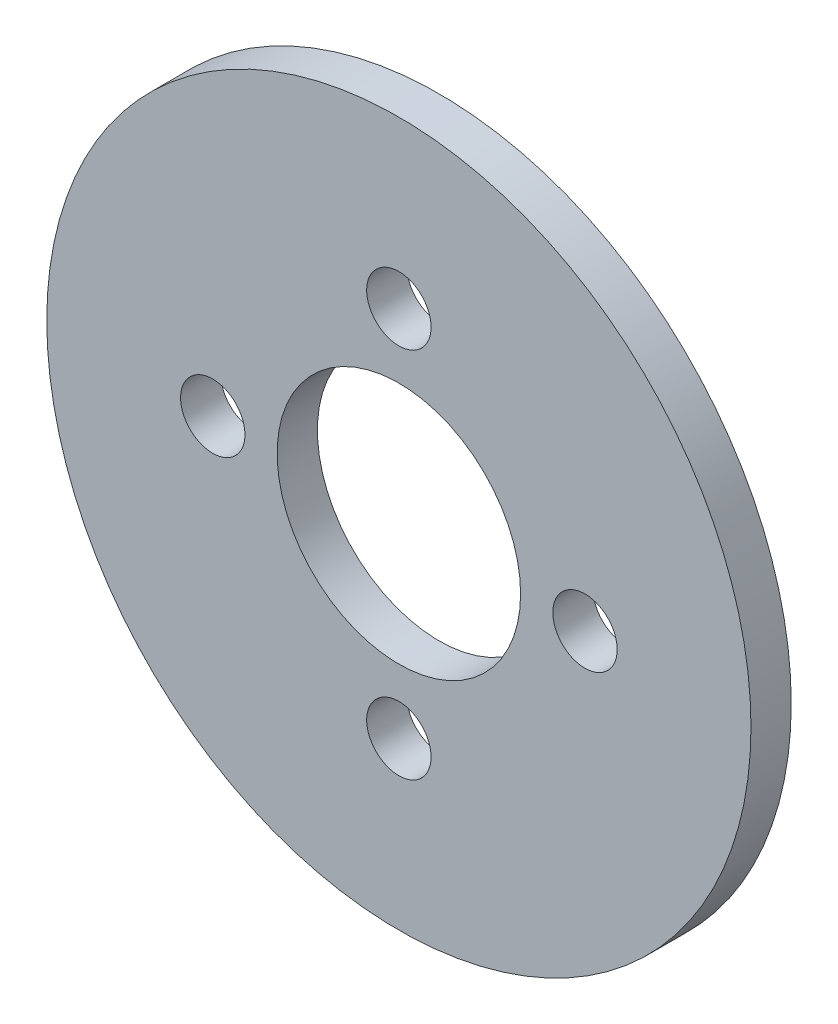
ISO-10303-21;
HEADER;
FILE_DESCRIPTION(('STEP AP214'),'2;1');
FILE_NAME('part.step','',(''),(''),'','','');
FILE_SCHEMA(('AUTOMOTIVE_DESIGN { 1 0 10303 214 1 1 1 1 }'));
ENDSEC;
DATA;
#1=APPLICATION_CONTEXT('core data for automotive mechanical design processes');
#2=APPLICATION_PROTOCOL_DEFINITION('international standard','automotive_design',2000,#1);
#3=PRODUCT_CONTEXT('',#1,'mechanical');
#4=PRODUCT('Part','Part','',(#3));
#5=PRODUCT_RELATED_PRODUCT_CATEGORY('part','',(#4));
#6=PRODUCT_DEFINITION_FORMATION('','',#4);
#7=PRODUCT_DEFINITION_CONTEXT('part definition',#1,'design');
#8=PRODUCT_DEFINITION('design','',#6,#7);
#9=PRODUCT_DEFINITION_SHAPE('','',#8);
#10=(LENGTH_UNIT() NAMED_UNIT(*) SI_UNIT(.MILLI.,.METRE.));
#11=(NAMED_UNIT(*) PLANE_ANGLE_UNIT() SI_UNIT($,.RADIAN.));
#12=(NAMED_UNIT(*) SI_UNIT($,.STERADIAN.) SOLID_ANGLE_UNIT());
#13=UNCERTAINTY_MEASURE_WITH_UNIT(LENGTH_MEASURE(1.E-05),#10,'distance_accuracy_value','');
#14=(GEOMETRIC_REPRESENTATION_CONTEXT(3) GLOBAL_UNCERTAINTY_ASSIGNED_CONTEXT((#13)) GLOBAL_UNIT_ASSIGNED_CONTEXT((#10,
#11,#12)) REPRESENTATION_CONTEXT('',''));
#15=CARTESIAN_POINT('',(0.,0.,0.));
#16=DIRECTION('',(0.,0.,1.));
#17=DIRECTION('',(1.,0.,0.));
#18=AXIS2_PLACEMENT_3D('',#15,#16,#17);
#19=CARTESIAN_POINT('',(0.,0.,2.));
#20=DIRECTION('',(0.,0.,1.));
#21=DIRECTION('',(1.,0.,0.));
#22=AXIS2_PLACEMENT_3D('',#19,#20,#21);
#23=PLANE('',#22);
#24=CARTESIAN_POINT('',(0.,-9.25,2.));
#25=DIRECTION('',(0.,0.,1.));
#26=DIRECTION('',(1.,0.,0.));
#27=AXIS2_PLACEMENT_3D('',#24,#25,#26);
#28=CIRCLE('',#27,1.6);
#29=CARTESIAN_POINT('',(1.6,-9.25,2.));
#30=VERTEX_POINT('',#29);
#31=EDGE_CURVE('E59',#30,#30,#28,.T.);
#32=ORIENTED_EDGE('',*,*,#31,.F.);
#33=EDGE_LOOP('',(#32));
#34=FACE_BOUND('',#33,.T.);
#35=CARTESIAN_POINT('',(9.25,0.,2.));
#36=DIRECTION('',(0.,0.,1.));
#37=DIRECTION('',(1.,0.,0.));
#38=AXIS2_PLACEMENT_3D('',#35,#36,#37);
#39=CIRCLE('',#38,1.6);
#40=CARTESIAN_POINT('',(10.85,0.,2.));
#41=VERTEX_POINT('',#40);
#42=EDGE_CURVE('E47',#41,#41,#39,.T.);
#43=ORIENTED_EDGE('',*,*,#42,.F.);
#44=EDGE_LOOP('',(#43));
#45=FACE_BOUND('',#44,.T.);
#46=CARTESIAN_POINT('',(0.,0.,2.));
#47=DIRECTION('',(0.,0.,1.));
#48=DIRECTION('',(1.,0.,0.));
#49=AXIS2_PLACEMENT_3D('',#46,#47,#48);
#50=CIRCLE('',#49,17.5);
#51=CARTESIAN_POINT('',(17.5,0.,2.));
#52=VERTEX_POINT('',#51);
#53=EDGE_CURVE('E10',#52,#52,#50,.T.);
#54=ORIENTED_EDGE('',*,*,#53,.T.);
#55=EDGE_LOOP('',(#54));
#56=FACE_BOUND('',#55,.T.);
#57=CARTESIAN_POINT('',(0.,9.25,2.));
#58=DIRECTION('',(0.,0.,1.));
#59=DIRECTION('',(1.,0.,0.));
#60=AXIS2_PLACEMENT_3D('',#57,#58,#59);
#61=CIRCLE('',#60,1.6);
#62=CARTESIAN_POINT('',(1.6,9.25,2.));
#63=VERTEX_POINT('',#62);
#64=EDGE_CURVE('E42',#63,#63,#61,.T.);
#65=ORIENTED_EDGE('',*,*,#64,.F.);
#66=EDGE_LOOP('',(#65));
#67=FACE_BOUND('',#66,.T.);
#68=CARTESIAN_POINT('',(-9.25,0.,2.));
#69=DIRECTION('',(0.,0.,1.));
#70=DIRECTION('',(1.,0.,0.));
#71=AXIS2_PLACEMENT_3D('',#68,#69,#70);
#72=CIRCLE('',#71,1.6);
#73=CARTESIAN_POINT('',(-7.65,0.,2.));
#74=VERTEX_POINT('',#73);
#75=EDGE_CURVE('E53',#74,#74,#72,.T.);
#76=ORIENTED_EDGE('',*,*,#75,.F.);
#77=EDGE_LOOP('',(#76));
#78=FACE_BOUND('',#77,.T.);
#79=CARTESIAN_POINT('',(0.,0.,2.));
#80=DIRECTION('',(0.,0.,1.));
#81=DIRECTION('',(1.,0.,0.));
#82=AXIS2_PLACEMENT_3D('',#79,#80,#81);
#83=CIRCLE('',#82,6.05);
#84=CARTESIAN_POINT('',(6.05,0.,2.));
#85=VERTEX_POINT('',#84);
#86=EDGE_CURVE('E65',#85,#85,#83,.T.);
#87=ORIENTED_EDGE('',*,*,#86,.F.);
#88=EDGE_LOOP('',(#87));
#89=FACE_BOUND('',#88,.T.);
#90=ADVANCED_FACE('F31',(#34,#45,#56,#67,#78,#89),#23,.T.);
#91=CARTESIAN_POINT('',(0.,0.,0.));
#92=DIRECTION('',(0.,0.,1.));
#93=DIRECTION('',(1.,0.,0.));
#94=AXIS2_PLACEMENT_3D('',#91,#92,#93);
#95=PLANE('',#94);
#96=CARTESIAN_POINT('',(0.,0.,0.));
#97=DIRECTION('',(0.,0.,1.));
#98=DIRECTION('',(1.,0.,0.));
#99=AXIS2_PLACEMENT_3D('',#96,#97,#98);
#100=CIRCLE('',#99,17.5);
#101=CARTESIAN_POINT('',(17.5,0.,0.));
#102=VERTEX_POINT('',#101);
#103=EDGE_CURVE('E35',#102,#102,#100,.T.);
#104=ORIENTED_EDGE('',*,*,#103,.F.);
#105=EDGE_LOOP('',(#104));
#106=FACE_BOUND('',#105,.T.);
#107=CARTESIAN_POINT('',(0.,9.25,0.));
#108=DIRECTION('',(0.,0.,1.));
#109=DIRECTION('',(1.,0.,0.));
#110=AXIS2_PLACEMENT_3D('',#107,#108,#109);
#111=CIRCLE('',#110,1.6);
#112=CARTESIAN_POINT('',(1.6,9.25,0.));
#113=VERTEX_POINT('',#112);
#114=EDGE_CURVE('E44',#113,#113,#111,.T.);
#115=ORIENTED_EDGE('',*,*,#114,.T.);
#116=EDGE_LOOP('',(#115));
#117=FACE_BOUND('',#116,.T.);
#118=CARTESIAN_POINT('',(9.25,0.,0.));
#119=DIRECTION('',(0.,0.,1.));
#120=DIRECTION('',(1.,0.,0.));
#121=AXIS2_PLACEMENT_3D('',#118,#119,#120);
#122=CIRCLE('',#121,1.6);
#123=CARTESIAN_POINT('',(10.85,0.,0.));
#124=VERTEX_POINT('',#123);
#125=EDGE_CURVE('E50',#124,#124,#122,.T.);
#126=ORIENTED_EDGE('',*,*,#125,.T.);
#127=EDGE_LOOP('',(#126));
#128=FACE_BOUND('',#127,.T.);
#129=CARTESIAN_POINT('',(-9.25,0.,0.));
#130=DIRECTION('',(0.,0.,1.));
#131=DIRECTION('',(1.,0.,0.));
#132=AXIS2_PLACEMENT_3D('',#129,#130,#131);
#133=CIRCLE('',#132,1.6);
#134=CARTESIAN_POINT('',(-7.65,0.,0.));
#135=VERTEX_POINT('',#134);
#136=EDGE_CURVE('E56',#135,#135,#133,.T.);
#137=ORIENTED_EDGE('',*,*,#136,.T.);
#138=EDGE_LOOP('',(#137));
#139=FACE_BOUND('',#138,.T.);
#140=CARTESIAN_POINT('',(0.,-9.25,0.));
#141=DIRECTION('',(0.,0.,1.));
#142=DIRECTION('',(1.,0.,0.));
#143=AXIS2_PLACEMENT_3D('',#140,#141,#142);
#144=CIRCLE('',#143,1.6);
#145=CARTESIAN_POINT('',(1.6,-9.25,0.));
#146=VERTEX_POINT('',#145);
#147=EDGE_CURVE('E62',#146,#146,#144,.T.);
#148=ORIENTED_EDGE('',*,*,#147,.T.);
#149=EDGE_LOOP('',(#148));
#150=FACE_BOUND('',#149,.T.);
#151=CARTESIAN_POINT('',(0.,0.,0.));
#152=DIRECTION('',(0.,0.,1.));
#153=DIRECTION('',(1.,0.,0.));
#154=AXIS2_PLACEMENT_3D('',#151,#152,#153);
#155=CIRCLE('',#154,6.05);
#156=CARTESIAN_POINT('',(6.05,0.,0.));
#157=VERTEX_POINT('',#156);
#158=EDGE_CURVE('E68',#157,#157,#155,.T.);
#159=ORIENTED_EDGE('',*,*,#158,.T.);
#160=EDGE_LOOP('',(#159));
#161=FACE_BOUND('',#160,.T.);
#162=ADVANCED_FACE('F78',(#106,#117,#128,#139,#150,#161),#95,.F.);
#163=CARTESIAN_POINT('',(0.,0.,2.));
#164=DIRECTION('',(0.,0.,-1.));
#165=DIRECTION('',(-1.,0.,0.));
#166=AXIS2_PLACEMENT_3D('',#163,#164,#165);
#167=CYLINDRICAL_SURFACE('',#166,17.5);
#168=ORIENTED_EDGE('',*,*,#53,.F.);
#169=EDGE_LOOP('',(#168));
#170=FACE_BOUND('',#169,.T.);
#171=ORIENTED_EDGE('',*,*,#103,.T.);
#172=EDGE_LOOP('',(#171));
#173=FACE_BOUND('',#172,.T.);
#174=ADVANCED_FACE('F33',(#170,#173),#167,.T.);
#175=CARTESIAN_POINT('',(0.,9.25,2.));
#176=DIRECTION('',(0.,0.,-1.));
#177=DIRECTION('',(-1.,0.,0.));
#178=AXIS2_PLACEMENT_3D('',#175,#176,#177);
#179=CYLINDRICAL_SURFACE('',#178,1.6);
#180=ORIENTED_EDGE('',*,*,#64,.T.);
#181=EDGE_LOOP('',(#180));
#182=FACE_BOUND('',#181,.T.);
#183=ORIENTED_EDGE('',*,*,#114,.F.);
#184=EDGE_LOOP('',(#183));
#185=FACE_BOUND('',#184,.T.);
#186=ADVANCED_FACE('F88',(#182,#185),#179,.F.);
#187=CARTESIAN_POINT('',(9.25,0.,2.));
#188=DIRECTION('',(0.,0.,-1.));
#189=DIRECTION('',(-1.,0.,0.));
#190=AXIS2_PLACEMENT_3D('',#187,#188,#189);
#191=CYLINDRICAL_SURFACE('',#190,1.6);
#192=ORIENTED_EDGE('',*,*,#42,.T.);
#193=EDGE_LOOP('',(#192));
#194=FACE_BOUND('',#193,.T.);
#195=ORIENTED_EDGE('',*,*,#125,.F.);
#196=EDGE_LOOP('',(#195));
#197=FACE_BOUND('',#196,.T.);
#198=ADVANCED_FACE('F91',(#194,#197),#191,.F.);
#199=CARTESIAN_POINT('',(-9.25,0.,2.));
#200=DIRECTION('',(0.,0.,-1.));
#201=DIRECTION('',(-1.,0.,0.));
#202=AXIS2_PLACEMENT_3D('',#199,#200,#201);
#203=CYLINDRICAL_SURFACE('',#202,1.6);
#204=ORIENTED_EDGE('',*,*,#75,.T.);
#205=EDGE_LOOP('',(#204));
#206=FACE_BOUND('',#205,.T.);
#207=ORIENTED_EDGE('',*,*,#136,.F.);
#208=EDGE_LOOP('',(#207));
#209=FACE_BOUND('',#208,.T.);
#210=ADVANCED_FACE('F95',(#206,#209),#203,.F.);
#211=CARTESIAN_POINT('',(0.,-9.25,2.));
#212=DIRECTION('',(0.,0.,-1.));
#213=DIRECTION('',(-1.,0.,0.));
#214=AXIS2_PLACEMENT_3D('',#211,#212,#213);
#215=CYLINDRICAL_SURFACE('',#214,1.6);
#216=ORIENTED_EDGE('',*,*,#31,.T.);
#217=EDGE_LOOP('',(#216));
#218=FACE_BOUND('',#217,.T.);
#219=ORIENTED_EDGE('',*,*,#147,.F.);
#220=EDGE_LOOP('',(#219));
#221=FACE_BOUND('',#220,.T.);
#222=ADVANCED_FACE('F99',(#218,#221),#215,.F.);
#223=CARTESIAN_POINT('',(0.,0.,2.));
#224=DIRECTION('',(0.,0.,-1.));
#225=DIRECTION('',(-1.,0.,0.));
#226=AXIS2_PLACEMENT_3D('',#223,#224,#225);
#227=CYLINDRICAL_SURFACE('',#226,6.05);
#228=ORIENTED_EDGE('',*,*,#86,.T.);
#229=EDGE_LOOP('',(#228));
#230=FACE_BOUND('',#229,.T.);
#231=ORIENTED_EDGE('',*,*,#158,.F.);
#232=EDGE_LOOP('',(#231));
#233=FACE_BOUND('',#232,.T.);
#234=ADVANCED_FACE('F74',(#230,#233),#227,.F.);
#235=CLOSED_SHELL('',(#90,#162,#174,#186,#198,#210,#222,#234));
#236=MANIFOLD_SOLID_BREP('B2',#235);
#237=ADVANCED_BREP_SHAPE_REPRESENTATION('',(#18,#236),#14);
#238=SHAPE_DEFINITION_REPRESENTATION(#9,#237);
ENDSEC;
END-ISO-10303-21;
